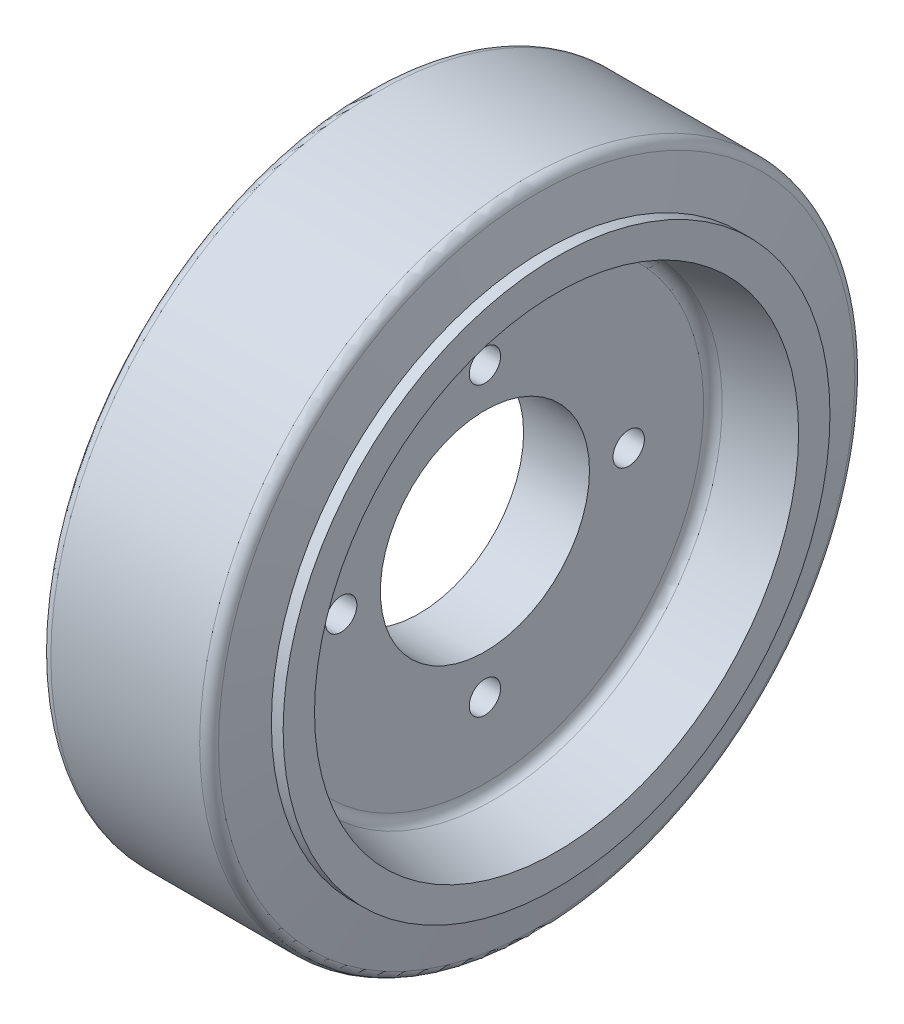
ISO-10303-21;
HEADER;
FILE_DESCRIPTION(('STEP AP214'),'2;1');
FILE_NAME('part.step','',(''),(''),'','','');
FILE_SCHEMA(('AUTOMOTIVE_DESIGN { 1 0 10303 214 1 1 1 1 }'));
ENDSEC;
DATA;
#1=APPLICATION_CONTEXT('core data for automotive mechanical design processes');
#2=APPLICATION_PROTOCOL_DEFINITION('international standard','automotive_design',2000,#1);
#3=PRODUCT_CONTEXT('',#1,'mechanical');
#4=PRODUCT('Part','Part','',(#3));
#5=PRODUCT_RELATED_PRODUCT_CATEGORY('part','',(#4));
#6=PRODUCT_DEFINITION_FORMATION('','',#4);
#7=PRODUCT_DEFINITION_CONTEXT('part definition',#1,'design');
#8=PRODUCT_DEFINITION('design','',#6,#7);
#9=PRODUCT_DEFINITION_SHAPE('','',#8);
#10=(LENGTH_UNIT() NAMED_UNIT(*) SI_UNIT(.MILLI.,.METRE.));
#11=(NAMED_UNIT(*) PLANE_ANGLE_UNIT() SI_UNIT($,.RADIAN.));
#12=(NAMED_UNIT(*) SI_UNIT($,.STERADIAN.) SOLID_ANGLE_UNIT());
#13=UNCERTAINTY_MEASURE_WITH_UNIT(LENGTH_MEASURE(1.E-05),#10,'distance_accuracy_value','');
#14=(GEOMETRIC_REPRESENTATION_CONTEXT(3) GLOBAL_UNCERTAINTY_ASSIGNED_CONTEXT((#13)) GLOBAL_UNIT_ASSIGNED_CONTEXT((#10,
#11,#12)) REPRESENTATION_CONTEXT('',''));
#15=CARTESIAN_POINT('',(0.,0.,0.));
#16=DIRECTION('',(0.,0.,1.));
#17=DIRECTION('',(1.,0.,0.));
#18=AXIS2_PLACEMENT_3D('',#15,#16,#17);
#19=CARTESIAN_POINT('',(15.9,0.,0.));
#20=DIRECTION('',(-1.,0.,0.));
#21=DIRECTION('',(0.,0.,-1.));
#22=AXIS2_PLACEMENT_3D('',#19,#20,#21);
#23=CONICAL_SURFACE('',#22,62.5,1.39137423336047);
#24=CARTESIAN_POINT('',(16.1980092545903,0.,0.));
#25=DIRECTION('',(-1.,0.,0.));
#26=DIRECTION('',(0.,0.,1.));
#27=AXIS2_PLACEMENT_3D('',#24,#25,#26);
#28=CIRCLE('',#27,60.8569219476642);
#29=CARTESIAN_POINT('',(16.1980092545903,0.,60.8569219476642));
#30=VERTEX_POINT('',#29);
#31=EDGE_CURVE('E10',#30,#30,#28,.T.);
#32=ORIENTED_EDGE('',*,*,#31,.F.);
#33=EDGE_LOOP('',(#32));
#34=FACE_BOUND('',#33,.T.);
#35=CARTESIAN_POINT('',(17.75,0.,0.));
#36=DIRECTION('',(1.,0.,0.));
#37=DIRECTION('',(0.,0.,-1.));
#38=AXIS2_PLACEMENT_3D('',#35,#36,#37);
#39=CIRCLE('',#38,52.3);
#40=CARTESIAN_POINT('',(17.75,0.,-52.3));
#41=VERTEX_POINT('',#40);
#42=EDGE_CURVE('E69',#41,#41,#39,.T.);
#43=ORIENTED_EDGE('',*,*,#42,.F.);
#44=EDGE_LOOP('',(#43));
#45=FACE_BOUND('',#44,.T.);
#46=ADVANCED_FACE('F37',(#34,#45),#23,.T.);
#47=CARTESIAN_POINT('',(0.,0.,0.));
#48=DIRECTION('',(-1.,0.,0.));
#49=DIRECTION('',(0.,0.,-1.));
#50=AXIS2_PLACEMENT_3D('',#47,#48,#49);
#51=CYLINDRICAL_SURFACE('',#50,52.3);
#52=CARTESIAN_POINT('',(20.,0.,0.));
#53=DIRECTION('',(1.,0.,0.));
#54=DIRECTION('',(0.,0.,-1.));
#55=AXIS2_PLACEMENT_3D('',#52,#53,#54);
#56=CIRCLE('',#55,52.3);
#57=CARTESIAN_POINT('',(20.,0.,-52.3));
#58=VERTEX_POINT('',#57);
#59=EDGE_CURVE('E72',#58,#58,#56,.T.);
#60=ORIENTED_EDGE('',*,*,#59,.F.);
#61=EDGE_LOOP('',(#60));
#62=FACE_BOUND('',#61,.T.);
#63=ORIENTED_EDGE('',*,*,#42,.T.);
#64=EDGE_LOOP('',(#63));
#65=FACE_BOUND('',#64,.T.);
#66=ADVANCED_FACE('F131',(#62,#65),#51,.T.);
#67=CARTESIAN_POINT('',(20.,-52.3,0.));
#68=DIRECTION('',(1.,0.,0.));
#69=DIRECTION('',(0.,0.,1.));
#70=AXIS2_PLACEMENT_3D('',#67,#68,#69);
#71=PLANE('',#70);
#72=CARTESIAN_POINT('',(20.,0.,0.));
#73=DIRECTION('',(1.,0.,0.));
#74=DIRECTION('',(0.,0.,-1.));
#75=AXIS2_PLACEMENT_3D('',#72,#73,#74);
#76=CIRCLE('',#75,46.3);
#77=CARTESIAN_POINT('',(20.,0.,-46.3));
#78=VERTEX_POINT('',#77);
#79=EDGE_CURVE('E75',#78,#78,#76,.T.);
#80=ORIENTED_EDGE('',*,*,#79,.F.);
#81=EDGE_LOOP('',(#80));
#82=FACE_BOUND('',#81,.T.);
#83=ORIENTED_EDGE('',*,*,#59,.T.);
#84=EDGE_LOOP('',(#83));
#85=FACE_BOUND('',#84,.T.);
#86=ADVANCED_FACE('F137',(#82,#85),#71,.T.);
#87=CARTESIAN_POINT('',(20.,0.,0.));
#88=DIRECTION('',(1.,0.,0.));
#89=DIRECTION('',(0.,0.,1.));
#90=AXIS2_PLACEMENT_3D('',#87,#88,#89);
#91=CONICAL_SURFACE('',#90,46.3,0.205103886501625);
#92=CARTESIAN_POINT('',(7.89266225994668,0.,0.));
#93=DIRECTION('',(-1.,0.,0.));
#94=DIRECTION('',(0.,0.,1.));
#95=AXIS2_PLACEMENT_3D('',#92,#93,#94);
#96=CIRCLE('',#95,43.7813202511568);
#97=CARTESIAN_POINT('',(7.89266225994668,0.,43.7813202511568));
#98=VERTEX_POINT('',#97);
#99=EDGE_CURVE('E66',#98,#98,#96,.F.);
#100=ORIENTED_EDGE('',*,*,#99,.F.);
#101=EDGE_LOOP('',(#100));
#102=FACE_BOUND('',#101,.T.);
#103=ORIENTED_EDGE('',*,*,#79,.T.);
#104=EDGE_LOOP('',(#103));
#105=FACE_BOUND('',#104,.T.);
#106=ADVANCED_FACE('F193',(#102,#105),#91,.F.);
#107=CARTESIAN_POINT('',(6.3,-43.45,0.));
#108=DIRECTION('',(1.,0.,0.));
#109=DIRECTION('',(0.,0.,1.));
#110=AXIS2_PLACEMENT_3D('',#107,#108,#109);
#111=PLANE('',#110);
#112=CARTESIAN_POINT('',(6.3,0.,-27.5));
#113=DIRECTION('',(-1.,0.,0.));
#114=DIRECTION('',(0.,0.,1.));
#115=AXIS2_PLACEMENT_3D('',#112,#113,#114);
#116=CIRCLE('',#115,3.);
#117=CARTESIAN_POINT('',(6.3,0.,-24.5));
#118=VERTEX_POINT('',#117);
#119=EDGE_CURVE('E108',#118,#118,#116,.T.);
#120=ORIENTED_EDGE('',*,*,#119,.T.);
#121=EDGE_LOOP('',(#120));
#122=FACE_BOUND('',#121,.T.);
#123=CARTESIAN_POINT('',(6.3,-27.5,0.));
#124=DIRECTION('',(-1.,0.,0.));
#125=DIRECTION('',(0.,0.,1.));
#126=AXIS2_PLACEMENT_3D('',#123,#124,#125);
#127=CIRCLE('',#126,3.);
#128=CARTESIAN_POINT('',(6.3,-27.5,3.));
#129=VERTEX_POINT('',#128);
#130=EDGE_CURVE('E102',#129,#129,#127,.T.);
#131=ORIENTED_EDGE('',*,*,#130,.T.);
#132=EDGE_LOOP('',(#131));
#133=FACE_BOUND('',#132,.T.);
#134=CARTESIAN_POINT('',(6.3,0.,27.5));
#135=DIRECTION('',(-1.,0.,0.));
#136=DIRECTION('',(0.,0.,1.));
#137=AXIS2_PLACEMENT_3D('',#134,#135,#136);
#138=CIRCLE('',#137,3.);
#139=CARTESIAN_POINT('',(6.3,0.,30.5));
#140=VERTEX_POINT('',#139);
#141=EDGE_CURVE('E96',#140,#140,#138,.T.);
#142=ORIENTED_EDGE('',*,*,#141,.T.);
#143=EDGE_LOOP('',(#142));
#144=FACE_BOUND('',#143,.T.);
#145=CARTESIAN_POINT('',(6.3,27.5,0.));
#146=DIRECTION('',(-1.,0.,0.));
#147=DIRECTION('',(0.,0.,1.));
#148=AXIS2_PLACEMENT_3D('',#145,#146,#147);
#149=CIRCLE('',#148,3.);
#150=CARTESIAN_POINT('',(6.3,27.5,3.));
#151=VERTEX_POINT('',#150);
#152=EDGE_CURVE('E90',#151,#151,#149,.T.);
#153=ORIENTED_EDGE('',*,*,#152,.T.);
#154=EDGE_LOOP('',(#153));
#155=FACE_BOUND('',#154,.T.);
#156=CARTESIAN_POINT('',(6.3,0.,0.));
#157=DIRECTION('',(-1.,0.,0.));
#158=DIRECTION('',(0.,0.,1.));
#159=AXIS2_PLACEMENT_3D('',#156,#157,#158);
#160=CIRCLE('',#159,20.);
#161=CARTESIAN_POINT('',(6.3,0.,-20.));
#162=VERTEX_POINT('',#161);
#163=EDGE_CURVE('E87',#162,#162,#160,.T.);
#164=ORIENTED_EDGE('',*,*,#163,.T.);
#165=EDGE_LOOP('',(#164));
#166=FACE_BOUND('',#165,.T.);
#167=CARTESIAN_POINT('',(6.3,0.,0.));
#168=DIRECTION('',(-1.,0.,0.));
#169=DIRECTION('',(0.,0.,1.));
#170=AXIS2_PLACEMENT_3D('',#167,#168,#169);
#171=CIRCLE('',#170,41.8232405884443);
#172=CARTESIAN_POINT('',(6.3,0.,41.8232405884443));
#173=VERTEX_POINT('',#172);
#174=EDGE_CURVE('E63',#173,#173,#171,.T.);
#175=ORIENTED_EDGE('',*,*,#174,.F.);
#176=EDGE_LOOP('',(#175));
#177=FACE_BOUND('',#176,.T.);
#178=ADVANCED_FACE('F187',(#122,#133,#144,#155,#166,#177),#111,.T.);
#179=CARTESIAN_POINT('',(-6.3,-43.45,0.));
#180=DIRECTION('',(-1.,0.,0.));
#181=DIRECTION('',(0.,0.,-1.));
#182=AXIS2_PLACEMENT_3D('',#179,#180,#181);
#183=PLANE('',#182);
#184=CARTESIAN_POINT('',(-6.3,0.,-27.5));
#185=DIRECTION('',(1.,0.,0.));
#186=DIRECTION('',(0.,0.,-1.));
#187=AXIS2_PLACEMENT_3D('',#184,#185,#186);
#188=CIRCLE('',#187,3.);
#189=CARTESIAN_POINT('',(-6.3,0.,-30.5));
#190=VERTEX_POINT('',#189);
#191=EDGE_CURVE('E111',#190,#190,#188,.T.);
#192=ORIENTED_EDGE('',*,*,#191,.T.);
#193=EDGE_LOOP('',(#192));
#194=FACE_BOUND('',#193,.T.);
#195=CARTESIAN_POINT('',(-6.3,-27.5,0.));
#196=DIRECTION('',(1.,0.,0.));
#197=DIRECTION('',(0.,0.,-1.));
#198=AXIS2_PLACEMENT_3D('',#195,#196,#197);
#199=CIRCLE('',#198,3.);
#200=CARTESIAN_POINT('',(-6.3,-27.5,-3.));
#201=VERTEX_POINT('',#200);
#202=EDGE_CURVE('E105',#201,#201,#199,.T.);
#203=ORIENTED_EDGE('',*,*,#202,.T.);
#204=EDGE_LOOP('',(#203));
#205=FACE_BOUND('',#204,.T.);
#206=CARTESIAN_POINT('',(-6.3,0.,27.5));
#207=DIRECTION('',(1.,0.,0.));
#208=DIRECTION('',(0.,0.,-1.));
#209=AXIS2_PLACEMENT_3D('',#206,#207,#208);
#210=CIRCLE('',#209,3.);
#211=CARTESIAN_POINT('',(-6.3,0.,24.5));
#212=VERTEX_POINT('',#211);
#213=EDGE_CURVE('E99',#212,#212,#210,.T.);
#214=ORIENTED_EDGE('',*,*,#213,.T.);
#215=EDGE_LOOP('',(#214));
#216=FACE_BOUND('',#215,.T.);
#217=CARTESIAN_POINT('',(-6.3,27.5,0.));
#218=DIRECTION('',(1.,0.,0.));
#219=DIRECTION('',(0.,0.,-1.));
#220=AXIS2_PLACEMENT_3D('',#217,#218,#219);
#221=CIRCLE('',#220,3.);
#222=CARTESIAN_POINT('',(-6.3,27.5,-3.));
#223=VERTEX_POINT('',#222);
#224=EDGE_CURVE('E93',#223,#223,#221,.T.);
#225=ORIENTED_EDGE('',*,*,#224,.T.);
#226=EDGE_LOOP('',(#225));
#227=FACE_BOUND('',#226,.T.);
#228=CARTESIAN_POINT('',(-6.3,0.,0.));
#229=DIRECTION('',(1.,0.,0.));
#230=DIRECTION('',(0.,0.,-1.));
#231=AXIS2_PLACEMENT_3D('',#228,#229,#230);
#232=CIRCLE('',#231,20.);
#233=CARTESIAN_POINT('',(-6.3,0.,-20.));
#234=VERTEX_POINT('',#233);
#235=EDGE_CURVE('E41',#234,#234,#232,.T.);
#236=ORIENTED_EDGE('',*,*,#235,.T.);
#237=EDGE_LOOP('',(#236));
#238=FACE_BOUND('',#237,.T.);
#239=CARTESIAN_POINT('',(-6.3,0.,0.));
#240=DIRECTION('',(1.,0.,0.));
#241=DIRECTION('',(0.,0.,-1.));
#242=AXIS2_PLACEMENT_3D('',#239,#240,#241);
#243=CIRCLE('',#242,41.8232405884443);
#244=CARTESIAN_POINT('',(-6.3,0.,-41.8232405884443));
#245=VERTEX_POINT('',#244);
#246=EDGE_CURVE('E60',#245,#245,#243,.T.);
#247=ORIENTED_EDGE('',*,*,#246,.F.);
#248=EDGE_LOOP('',(#247));
#249=FACE_BOUND('',#248,.T.);
#250=ADVANCED_FACE('F115',(#194,#205,#216,#227,#238,#249),#183,.T.);
#251=CARTESIAN_POINT('',(-6.3,0.,0.));
#252=DIRECTION('',(-1.,0.,0.));
#253=DIRECTION('',(0.,0.,-1.));
#254=AXIS2_PLACEMENT_3D('',#251,#252,#253);
#255=CONICAL_SURFACE('',#254,43.45,0.205103886501625);
#256=CARTESIAN_POINT('',(-7.89266225994668,0.,0.));
#257=DIRECTION('',(1.,0.,0.));
#258=DIRECTION('',(0.,0.,-1.));
#259=AXIS2_PLACEMENT_3D('',#256,#257,#258);
#260=CIRCLE('',#259,43.7813202511568);
#261=CARTESIAN_POINT('',(-7.89266225994668,0.,-43.7813202511568));
#262=VERTEX_POINT('',#261);
#263=EDGE_CURVE('E57',#262,#262,#260,.F.);
#264=ORIENTED_EDGE('',*,*,#263,.F.);
#265=EDGE_LOOP('',(#264));
#266=FACE_BOUND('',#265,.T.);
#267=CARTESIAN_POINT('',(-20.,0.,0.));
#268=DIRECTION('',(1.,0.,0.));
#269=DIRECTION('',(0.,0.,-1.));
#270=AXIS2_PLACEMENT_3D('',#267,#268,#269);
#271=CIRCLE('',#270,46.3);
#272=CARTESIAN_POINT('',(-20.,0.,-46.3));
#273=VERTEX_POINT('',#272);
#274=EDGE_CURVE('E78',#273,#273,#271,.T.);
#275=ORIENTED_EDGE('',*,*,#274,.F.);
#276=EDGE_LOOP('',(#275));
#277=FACE_BOUND('',#276,.T.);
#278=ADVANCED_FACE('F177',(#266,#277),#255,.F.);
#279=CARTESIAN_POINT('',(-20.,-52.3,0.));
#280=DIRECTION('',(-1.,0.,0.));
#281=DIRECTION('',(0.,0.,-1.));
#282=AXIS2_PLACEMENT_3D('',#279,#280,#281);
#283=PLANE('',#282);
#284=CARTESIAN_POINT('',(-20.,0.,0.));
#285=DIRECTION('',(1.,0.,0.));
#286=DIRECTION('',(0.,0.,-1.));
#287=AXIS2_PLACEMENT_3D('',#284,#285,#286);
#288=CIRCLE('',#287,52.3);
#289=CARTESIAN_POINT('',(-20.,0.,-52.3));
#290=VERTEX_POINT('',#289);
#291=EDGE_CURVE('E81',#290,#290,#288,.T.);
#292=ORIENTED_EDGE('',*,*,#291,.F.);
#293=EDGE_LOOP('',(#292));
#294=FACE_BOUND('',#293,.T.);
#295=ORIENTED_EDGE('',*,*,#274,.T.);
#296=EDGE_LOOP('',(#295));
#297=FACE_BOUND('',#296,.T.);
#298=ADVANCED_FACE('F171',(#294,#297),#283,.T.);
#299=CARTESIAN_POINT('',(0.,0.,0.));
#300=DIRECTION('',(-1.,0.,0.));
#301=DIRECTION('',(0.,0.,-1.));
#302=AXIS2_PLACEMENT_3D('',#299,#300,#301);
#303=CYLINDRICAL_SURFACE('',#302,52.3);
#304=CARTESIAN_POINT('',(-17.75,0.,0.));
#305=DIRECTION('',(1.,0.,0.));
#306=DIRECTION('',(0.,0.,-1.));
#307=AXIS2_PLACEMENT_3D('',#304,#305,#306);
#308=CIRCLE('',#307,52.3);
#309=CARTESIAN_POINT('',(-17.75,0.,-52.3));
#310=VERTEX_POINT('',#309);
#311=EDGE_CURVE('E84',#310,#310,#308,.T.);
#312=ORIENTED_EDGE('',*,*,#311,.F.);
#313=EDGE_LOOP('',(#312));
#314=FACE_BOUND('',#313,.T.);
#315=ORIENTED_EDGE('',*,*,#291,.T.);
#316=EDGE_LOOP('',(#315));
#317=FACE_BOUND('',#316,.T.);
#318=ADVANCED_FACE('F165',(#314,#317),#303,.T.);
#319=CARTESIAN_POINT('',(-17.75,0.,0.));
#320=DIRECTION('',(1.,0.,0.));
#321=DIRECTION('',(0.,0.,1.));
#322=AXIS2_PLACEMENT_3D('',#319,#320,#321);
#323=CONICAL_SURFACE('',#322,52.3,1.39137423336047);
#324=CARTESIAN_POINT('',(-16.1980092545903,0.,0.));
#325=DIRECTION('',(1.,0.,0.));
#326=DIRECTION('',(0.,0.,-1.));
#327=AXIS2_PLACEMENT_3D('',#324,#325,#326);
#328=CIRCLE('',#327,60.8569219476642);
#329=CARTESIAN_POINT('',(-16.1980092545903,0.,-60.8569219476642));
#330=VERTEX_POINT('',#329);
#331=EDGE_CURVE('E54',#330,#330,#328,.T.);
#332=ORIENTED_EDGE('',*,*,#331,.F.);
#333=EDGE_LOOP('',(#332));
#334=FACE_BOUND('',#333,.T.);
#335=ORIENTED_EDGE('',*,*,#311,.T.);
#336=EDGE_LOOP('',(#335));
#337=FACE_BOUND('',#336,.T.);
#338=ADVANCED_FACE('F162',(#334,#337),#323,.T.);
#339=CARTESIAN_POINT('',(0.,0.,0.));
#340=DIRECTION('',(-1.,0.,0.));
#341=DIRECTION('',(0.,0.,-1.));
#342=AXIS2_PLACEMENT_3D('',#339,#340,#341);
#343=CYLINDRICAL_SURFACE('',#342,62.5);
#344=CARTESIAN_POINT('',(-14.2301152728739,0.,0.));
#345=DIRECTION('',(-1.,0.,0.));
#346=DIRECTION('',(0.,0.,1.));
#347=AXIS2_PLACEMENT_3D('',#344,#345,#346);
#348=CIRCLE('',#347,62.5);
#349=CARTESIAN_POINT('',(-14.2301152728739,0.,62.5));
#350=VERTEX_POINT('',#349);
#351=EDGE_CURVE('E45',#350,#350,#348,.T.);
#352=ORIENTED_EDGE('',*,*,#351,.F.);
#353=EDGE_LOOP('',(#352));
#354=FACE_BOUND('',#353,.T.);
#355=CARTESIAN_POINT('',(14.2301152728739,0.,0.));
#356=DIRECTION('',(-1.,0.,0.));
#357=DIRECTION('',(0.,0.,1.));
#358=AXIS2_PLACEMENT_3D('',#355,#356,#357);
#359=CIRCLE('',#358,62.5);
#360=CARTESIAN_POINT('',(14.2301152728739,0.,62.5));
#361=VERTEX_POINT('',#360);
#362=EDGE_CURVE('E49',#361,#361,#359,.F.);
#363=ORIENTED_EDGE('',*,*,#362,.F.);
#364=EDGE_LOOP('',(#363));
#365=FACE_BOUND('',#364,.T.);
#366=ADVANCED_FACE('F147',(#354,#365),#343,.T.);
#367=CARTESIAN_POINT('',(8.3,0.,0.));
#368=DIRECTION('',(1.,0.,0.));
#369=DIRECTION('',(0.,0.,1.));
#370=AXIS2_PLACEMENT_3D('',#367,#368,#369);
#371=TOROIDAL_SURFACE('',#370,41.8232405884443,2.);
#372=ORIENTED_EDGE('',*,*,#174,.T.);
#373=EDGE_LOOP('',(#372));
#374=FACE_BOUND('',#373,.T.);
#375=ORIENTED_EDGE('',*,*,#99,.T.);
#376=EDGE_LOOP('',(#375));
#377=FACE_BOUND('',#376,.T.);
#378=ADVANCED_FACE('F143',(#374,#377),#371,.F.);
#379=CARTESIAN_POINT('',(-8.3,0.,0.));
#380=DIRECTION('',(-1.,0.,0.));
#381=DIRECTION('',(0.,0.,-1.));
#382=AXIS2_PLACEMENT_3D('',#379,#380,#381);
#383=TOROIDAL_SURFACE('',#382,41.8232405884443,2.);
#384=ORIENTED_EDGE('',*,*,#263,.T.);
#385=EDGE_LOOP('',(#384));
#386=FACE_BOUND('',#385,.T.);
#387=ORIENTED_EDGE('',*,*,#246,.T.);
#388=EDGE_LOOP('',(#387));
#389=FACE_BOUND('',#388,.T.);
#390=ADVANCED_FACE('F146',(#386,#389),#383,.F.);
#391=CARTESIAN_POINT('',(-14.2301152728739,0.,0.));
#392=DIRECTION('',(1.,0.,0.));
#393=DIRECTION('',(0.,0.,1.));
#394=AXIS2_PLACEMENT_3D('',#391,#392,#393);
#395=TOROIDAL_SURFACE('',#394,60.5,2.);
#396=ORIENTED_EDGE('',*,*,#351,.T.);
#397=EDGE_LOOP('',(#396));
#398=FACE_BOUND('',#397,.T.);
#399=ORIENTED_EDGE('',*,*,#331,.T.);
#400=EDGE_LOOP('',(#399));
#401=FACE_BOUND('',#400,.T.);
#402=ADVANCED_FACE('F150',(#398,#401),#395,.T.);
#403=CARTESIAN_POINT('',(14.2301152728739,0.,0.));
#404=DIRECTION('',(1.,0.,0.));
#405=DIRECTION('',(0.,0.,1.));
#406=AXIS2_PLACEMENT_3D('',#403,#404,#405);
#407=TOROIDAL_SURFACE('',#406,60.5,2.);
#408=ORIENTED_EDGE('',*,*,#31,.T.);
#409=EDGE_LOOP('',(#408));
#410=FACE_BOUND('',#409,.T.);
#411=ORIENTED_EDGE('',*,*,#362,.T.);
#412=EDGE_LOOP('',(#411));
#413=FACE_BOUND('',#412,.T.);
#414=ADVANCED_FACE('F39',(#410,#413),#407,.T.);
#415=CARTESIAN_POINT('',(22.2,0.,0.));
#416=DIRECTION('',(-1.,0.,0.));
#417=DIRECTION('',(0.,0.,-1.));
#418=AXIS2_PLACEMENT_3D('',#415,#416,#417);
#419=CYLINDRICAL_SURFACE('',#418,20.);
#420=CARTESIAN_POINT('',(6.3,0.,-20.));
#421=CARTESIAN_POINT('',(6.16875,0.,-20.));
#422=CARTESIAN_POINT('',(6.0375,0.,-20.));
#423=CARTESIAN_POINT('',(5.775,0.,-20.));
#424=CARTESIAN_POINT('',(5.64375,0.,-20.));
#425=CARTESIAN_POINT('',(5.38125,0.,-20.));
#426=CARTESIAN_POINT('',(5.25,0.,-20.));
#427=CARTESIAN_POINT('',(4.9875,0.,-20.));
#428=CARTESIAN_POINT('',(4.85625,0.,-20.));
#429=CARTESIAN_POINT('',(4.59375,0.,-20.));
#430=CARTESIAN_POINT('',(4.4625,0.,-20.));
#431=CARTESIAN_POINT('',(4.2,0.,-20.));
#432=CARTESIAN_POINT('',(4.06875,0.,-20.));
#433=CARTESIAN_POINT('',(3.80625,0.,-20.));
#434=CARTESIAN_POINT('',(3.675,0.,-20.));
#435=CARTESIAN_POINT('',(3.4125,0.,-20.));
#436=CARTESIAN_POINT('',(3.28125,0.,-20.));
#437=CARTESIAN_POINT('',(3.01875,0.,-20.));
#438=CARTESIAN_POINT('',(2.8875,0.,-20.));
#439=CARTESIAN_POINT('',(2.625,0.,-20.));
#440=CARTESIAN_POINT('',(2.49375,0.,-20.));
#441=CARTESIAN_POINT('',(2.23125,0.,-20.));
#442=CARTESIAN_POINT('',(2.1,0.,-20.));
#443=CARTESIAN_POINT('',(1.8375,0.,-20.));
#444=CARTESIAN_POINT('',(1.70625,0.,-20.));
#445=CARTESIAN_POINT('',(1.44375,0.,-20.));
#446=CARTESIAN_POINT('',(1.3125,0.,-20.));
#447=CARTESIAN_POINT('',(1.05,0.,-20.));
#448=CARTESIAN_POINT('',(0.918750000000001,0.,-20.));
#449=CARTESIAN_POINT('',(0.656249999999999,0.,-20.));
#450=CARTESIAN_POINT('',(0.524999999999999,0.,-20.));
#451=CARTESIAN_POINT('',(0.262499999999999,0.,-20.));
#452=CARTESIAN_POINT('',(0.131249999999999,0.,-20.));
#453=CARTESIAN_POINT('',(-0.131249999999999,0.,-20.));
#454=CARTESIAN_POINT('',(-0.262499999999999,0.,-20.));
#455=CARTESIAN_POINT('',(-0.524999999999999,0.,-20.));
#456=CARTESIAN_POINT('',(-0.656249999999999,0.,-20.));
#457=CARTESIAN_POINT('',(-0.918750000000001,0.,-20.));
#458=CARTESIAN_POINT('',(-1.05,0.,-20.));
#459=CARTESIAN_POINT('',(-1.3125,0.,-20.));
#460=CARTESIAN_POINT('',(-1.44375,0.,-20.));
#461=CARTESIAN_POINT('',(-1.70625,0.,-20.));
#462=CARTESIAN_POINT('',(-1.8375,0.,-20.));
#463=CARTESIAN_POINT('',(-2.1,0.,-20.));
#464=CARTESIAN_POINT('',(-2.23125,0.,-20.));
#465=CARTESIAN_POINT('',(-2.49375,0.,-20.));
#466=CARTESIAN_POINT('',(-2.625,0.,-20.));
#467=CARTESIAN_POINT('',(-2.8875,0.,-20.));
#468=CARTESIAN_POINT('',(-3.01875,0.,-20.));
#469=CARTESIAN_POINT('',(-3.28125,0.,-20.));
#470=CARTESIAN_POINT('',(-3.4125,0.,-20.));
#471=CARTESIAN_POINT('',(-3.675,0.,-20.));
#472=CARTESIAN_POINT('',(-3.80625,0.,-20.));
#473=CARTESIAN_POINT('',(-4.06875,0.,-20.));
#474=CARTESIAN_POINT('',(-4.2,0.,-20.));
#475=CARTESIAN_POINT('',(-4.4625,0.,-20.));
#476=CARTESIAN_POINT('',(-4.59375,0.,-20.));
#477=CARTESIAN_POINT('',(-4.85625,0.,-20.));
#478=CARTESIAN_POINT('',(-4.9875,0.,-20.));
#479=CARTESIAN_POINT('',(-5.25,0.,-20.));
#480=CARTESIAN_POINT('',(-5.38125,0.,-20.));
#481=CARTESIAN_POINT('',(-5.64375,0.,-20.));
#482=CARTESIAN_POINT('',(-5.775,0.,-20.));
#483=CARTESIAN_POINT('',(-6.0375,0.,-20.));
#484=CARTESIAN_POINT('',(-6.16875,0.,-20.));
#485=CARTESIAN_POINT('',(-6.3,0.,-20.));
#486=B_SPLINE_CURVE_WITH_KNOTS('',3,(#420,#421,#422,#423,#424,#425,#426,#427,#428,#429,#430,
#431,#432,#433,#434,#435,#436,#437,#438,#439,#440,#441,#442,#443,#444,#445,#446,#447,#448,#449,
#450,#451,#452,#453,#454,#455,#456,#457,#458,#459,#460,#461,#462,#463,#464,#465,#466,#467,#468,
#469,#470,#471,#472,#473,#474,#475,#476,#477,#478,#479,#480,#481,#482,#483,#484,#485),
.UNSPECIFIED.,.F.,.F.,(4,2,2,2,2,2,2,2,2,2,2,2,2,2,2,2,2,2,2,2,2,2,2,2,2,2,2,2,2,2,2,2,4),(0.,
0.393749999999998,0.7875,1.18125,1.575,1.96875,2.3625,2.75625,3.15,3.54375,3.9375,4.33125,4.725,
5.11875,5.5125,5.90625,6.3,6.69375,7.0875,7.48125,7.875,8.26875,8.6625,9.05625,9.45,9.84375,
10.2375,10.63125,11.025,11.41875,11.8125,12.20625,12.6),.UNSPECIFIED.);
#487=EDGE_CURVE('BSEAM157',#162,#234,#486,.T.);
#488=ORIENTED_EDGE('',*,*,#163,.F.);
#489=ORIENTED_EDGE('',*,*,#235,.F.);
#490=ORIENTED_EDGE('',*,*,#487,.T.);
#491=ORIENTED_EDGE('',*,*,#487,.F.);
#492=EDGE_LOOP('',(#488,#490,#489,#491));
#493=FACE_BOUND('',#492,.T.);
#494=ADVANCED_FACE('F157',(#493),#419,.F.);
#495=CARTESIAN_POINT('',(20.,27.5,0.));
#496=DIRECTION('',(-1.,0.,0.));
#497=DIRECTION('',(0.,0.,-1.));
#498=AXIS2_PLACEMENT_3D('',#495,#496,#497);
#499=CYLINDRICAL_SURFACE('',#498,3.);
#500=ORIENTED_EDGE('',*,*,#152,.F.);
#501=EDGE_LOOP('',(#500));
#502=FACE_BOUND('',#501,.T.);
#503=ORIENTED_EDGE('',*,*,#224,.F.);
#504=EDGE_LOOP('',(#503));
#505=FACE_BOUND('',#504,.T.);
#506=ADVANCED_FACE('F311',(#502,#505),#499,.F.);
#507=CARTESIAN_POINT('',(20.,0.,27.5));
#508=DIRECTION('',(-1.,0.,0.));
#509=DIRECTION('',(0.,0.,-1.));
#510=AXIS2_PLACEMENT_3D('',#507,#508,#509);
#511=CYLINDRICAL_SURFACE('',#510,3.);
#512=ORIENTED_EDGE('',*,*,#141,.F.);
#513=EDGE_LOOP('',(#512));
#514=FACE_BOUND('',#513,.T.);
#515=ORIENTED_EDGE('',*,*,#213,.F.);
#516=EDGE_LOOP('',(#515));
#517=FACE_BOUND('',#516,.T.);
#518=ADVANCED_FACE('F126',(#514,#517),#511,.F.);
#519=CARTESIAN_POINT('',(20.,-27.5,0.));
#520=DIRECTION('',(-1.,0.,0.));
#521=DIRECTION('',(0.,0.,-1.));
#522=AXIS2_PLACEMENT_3D('',#519,#520,#521);
#523=CYLINDRICAL_SURFACE('',#522,3.);
#524=ORIENTED_EDGE('',*,*,#130,.F.);
#525=EDGE_LOOP('',(#524));
#526=FACE_BOUND('',#525,.T.);
#527=ORIENTED_EDGE('',*,*,#202,.F.);
#528=EDGE_LOOP('',(#527));
#529=FACE_BOUND('',#528,.T.);
#530=ADVANCED_FACE('F120',(#526,#529),#523,.F.);
#531=CARTESIAN_POINT('',(20.,0.,-27.5));
#532=DIRECTION('',(-1.,0.,0.));
#533=DIRECTION('',(0.,0.,-1.));
#534=AXIS2_PLACEMENT_3D('',#531,#532,#533);
#535=CYLINDRICAL_SURFACE('',#534,3.);
#536=ORIENTED_EDGE('',*,*,#119,.F.);
#537=EDGE_LOOP('',(#536));
#538=FACE_BOUND('',#537,.T.);
#539=ORIENTED_EDGE('',*,*,#191,.F.);
#540=EDGE_LOOP('',(#539));
#541=FACE_BOUND('',#540,.T.);
#542=ADVANCED_FACE('F118',(#538,#541),#535,.F.);
#543=CLOSED_SHELL('',(#46,#66,#86,#106,#178,#250,#278,#298,#318,#338,#366,#378,#390,#402,#414,
#494,#506,#518,#530,#542));
#544=MANIFOLD_SOLID_BREP('B2',#543);
#545=ADVANCED_BREP_SHAPE_REPRESENTATION('',(#18,#544),#14);
#546=SHAPE_DEFINITION_REPRESENTATION(#9,#545);
ENDSEC;
END-ISO-10303-21;
